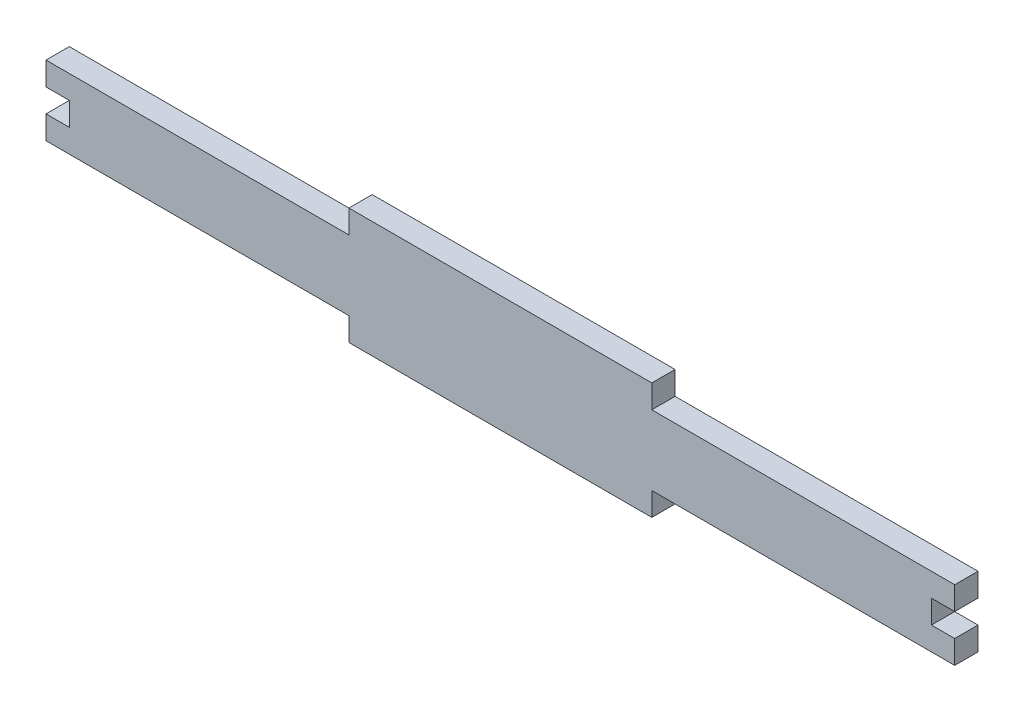
ISO-10303-21;
HEADER;
FILE_DESCRIPTION(('STEP AP214'),'2;1');
FILE_NAME('part.step','',(''),(''),'','','');
FILE_SCHEMA(('AUTOMOTIVE_DESIGN { 1 0 10303 214 1 1 1 1 }'));
ENDSEC;
DATA;
#1=APPLICATION_CONTEXT('core data for automotive mechanical design processes');
#2=APPLICATION_PROTOCOL_DEFINITION('international standard','automotive_design',2000,#1);
#3=PRODUCT_CONTEXT('',#1,'mechanical');
#4=PRODUCT('Part','Part','',(#3));
#5=PRODUCT_RELATED_PRODUCT_CATEGORY('part','',(#4));
#6=PRODUCT_DEFINITION_FORMATION('','',#4);
#7=PRODUCT_DEFINITION_CONTEXT('part definition',#1,'design');
#8=PRODUCT_DEFINITION('design','',#6,#7);
#9=PRODUCT_DEFINITION_SHAPE('','',#8);
#10=(LENGTH_UNIT() NAMED_UNIT(*) SI_UNIT(.MILLI.,.METRE.));
#11=(NAMED_UNIT(*) PLANE_ANGLE_UNIT() SI_UNIT($,.RADIAN.));
#12=(NAMED_UNIT(*) SI_UNIT($,.STERADIAN.) SOLID_ANGLE_UNIT());
#13=UNCERTAINTY_MEASURE_WITH_UNIT(LENGTH_MEASURE(1.E-05),#10,'distance_accuracy_value','');
#14=(GEOMETRIC_REPRESENTATION_CONTEXT(3) GLOBAL_UNCERTAINTY_ASSIGNED_CONTEXT((#13)) GLOBAL_UNIT_ASSIGNED_CONTEXT((#10,
#11,#12)) REPRESENTATION_CONTEXT('',''));
#15=CARTESIAN_POINT('',(0.,0.,0.));
#16=DIRECTION('',(0.,0.,1.));
#17=DIRECTION('',(1.,0.,0.));
#18=AXIS2_PLACEMENT_3D('',#15,#16,#17);
#19=CARTESIAN_POINT('',(-19.5,-7.5,3.));
#20=DIRECTION('',(1.,0.,0.));
#21=DIRECTION('',(0.,1.,0.));
#22=AXIS2_PLACEMENT_3D('',#19,#20,#21);
#23=PLANE('',#22);
#24=DIRECTION('',(0.,-1.,0.));
#25=VECTOR('',#24,1.);
#26=CARTESIAN_POINT('',(-19.5,-7.5,0.));
#27=LINE('',#26,#25);
#28=CARTESIAN_POINT('',(-19.5,-4.49999999999999,0.));
#29=VERTEX_POINT('',#28);
#30=CARTESIAN_POINT('',(-19.5,-7.5,0.));
#31=VERTEX_POINT('',#30);
#32=EDGE_CURVE('E201',#29,#31,#27,.T.);
#33=ORIENTED_EDGE('',*,*,#32,.T.);
#34=DIRECTION('',(0.,0.,-1.));
#35=VECTOR('',#34,1.);
#36=CARTESIAN_POINT('',(-19.5,-7.5,3.));
#37=LINE('',#36,#35);
#38=CARTESIAN_POINT('',(-19.5,-7.5,3.));
#39=VERTEX_POINT('',#38);
#40=EDGE_CURVE('E11',#39,#31,#37,.T.);
#41=ORIENTED_EDGE('',*,*,#40,.F.);
#42=DIRECTION('',(0.,-1.,0.));
#43=VECTOR('',#42,1.);
#44=CARTESIAN_POINT('',(-19.5,-7.5,3.));
#45=LINE('',#44,#43);
#46=CARTESIAN_POINT('',(-19.5,-4.49999999999999,3.));
#47=VERTEX_POINT('',#46);
#48=EDGE_CURVE('E239',#47,#39,#45,.T.);
#49=ORIENTED_EDGE('',*,*,#48,.F.);
#50=DIRECTION('',(0.,0.,-1.));
#51=VECTOR('',#50,1.);
#52=CARTESIAN_POINT('',(-19.5,-4.49999999999999,3.));
#53=LINE('',#52,#51);
#54=EDGE_CURVE('E197',#47,#29,#53,.T.);
#55=ORIENTED_EDGE('',*,*,#54,.T.);
#56=EDGE_LOOP('',(#33,#41,#49,#55));
#57=FACE_BOUND('',#56,.T.);
#58=ADVANCED_FACE('F33',(#57),#23,.F.);
#59=CARTESIAN_POINT('',(-19.5,-7.5,3.));
#60=DIRECTION('',(0.,1.,0.));
#61=DIRECTION('',(0.,0.,1.));
#62=AXIS2_PLACEMENT_3D('',#59,#60,#61);
#63=PLANE('',#62);
#64=DIRECTION('',(1.,0.,0.));
#65=VECTOR('',#64,1.);
#66=CARTESIAN_POINT('',(-19.5,-7.5,0.));
#67=LINE('',#66,#65);
#68=CARTESIAN_POINT('',(19.5,-7.5,0.));
#69=VERTEX_POINT('',#68);
#70=EDGE_CURVE('E204',#31,#69,#67,.T.);
#71=ORIENTED_EDGE('',*,*,#70,.T.);
#72=DIRECTION('',(0.,0.,-1.));
#73=VECTOR('',#72,1.);
#74=CARTESIAN_POINT('',(19.5,-7.5,3.));
#75=LINE('',#74,#73);
#76=CARTESIAN_POINT('',(19.5,-7.5,3.));
#77=VERTEX_POINT('',#76);
#78=EDGE_CURVE('E41',#77,#69,#75,.T.);
#79=ORIENTED_EDGE('',*,*,#78,.F.);
#80=DIRECTION('',(1.,0.,0.));
#81=VECTOR('',#80,1.);
#82=CARTESIAN_POINT('',(-19.5,-7.5,3.));
#83=LINE('',#82,#81);
#84=EDGE_CURVE('E128',#39,#77,#83,.T.);
#85=ORIENTED_EDGE('',*,*,#84,.F.);
#86=ORIENTED_EDGE('',*,*,#40,.T.);
#87=EDGE_LOOP('',(#71,#79,#85,#86));
#88=FACE_BOUND('',#87,.T.);
#89=ADVANCED_FACE('F357',(#88),#63,.F.);
#90=CARTESIAN_POINT('',(19.5,-4.49999999999999,3.));
#91=DIRECTION('',(-1.,0.,0.));
#92=DIRECTION('',(0.,-1.,0.));
#93=AXIS2_PLACEMENT_3D('',#90,#91,#92);
#94=PLANE('',#93);
#95=DIRECTION('',(0.,1.,0.));
#96=VECTOR('',#95,1.);
#97=CARTESIAN_POINT('',(19.5,-4.49999999999999,0.));
#98=LINE('',#97,#96);
#99=CARTESIAN_POINT('',(19.5,-4.49999999999999,0.));
#100=VERTEX_POINT('',#99);
#101=EDGE_CURVE('E206',#69,#100,#98,.T.);
#102=ORIENTED_EDGE('',*,*,#101,.T.);
#103=DIRECTION('',(0.,0.,-1.));
#104=VECTOR('',#103,1.);
#105=CARTESIAN_POINT('',(19.5,-4.49999999999999,3.));
#106=LINE('',#105,#104);
#107=CARTESIAN_POINT('',(19.5,-4.49999999999999,3.));
#108=VERTEX_POINT('',#107);
#109=EDGE_CURVE('E282',#108,#100,#106,.T.);
#110=ORIENTED_EDGE('',*,*,#109,.F.);
#111=DIRECTION('',(0.,1.,0.));
#112=VECTOR('',#111,1.);
#113=CARTESIAN_POINT('',(19.5,-4.49999999999999,3.));
#114=LINE('',#113,#112);
#115=EDGE_CURVE('E290',#77,#108,#114,.T.);
#116=ORIENTED_EDGE('',*,*,#115,.F.);
#117=ORIENTED_EDGE('',*,*,#78,.T.);
#118=EDGE_LOOP('',(#102,#110,#116,#117));
#119=FACE_BOUND('',#118,.T.);
#120=ADVANCED_FACE('F288',(#119),#94,.F.);
#121=CARTESIAN_POINT('',(58.5,-4.5,3.));
#122=DIRECTION('',(0.,1.,0.));
#123=DIRECTION('',(-1.,0.,0.));
#124=AXIS2_PLACEMENT_3D('',#121,#122,#123);
#125=PLANE('',#124);
#126=DIRECTION('',(1.,0.,0.));
#127=VECTOR('',#126,1.);
#128=CARTESIAN_POINT('',(58.5,-4.5,0.));
#129=LINE('',#128,#127);
#130=CARTESIAN_POINT('',(58.5,-4.5,0.));
#131=VERTEX_POINT('',#130);
#132=EDGE_CURVE('E208',#100,#131,#129,.T.);
#133=ORIENTED_EDGE('',*,*,#132,.T.);
#134=DIRECTION('',(0.,0.,-1.));
#135=VECTOR('',#134,1.);
#136=CARTESIAN_POINT('',(58.5,-4.5,3.));
#137=LINE('',#136,#135);
#138=CARTESIAN_POINT('',(58.5,-4.5,3.));
#139=VERTEX_POINT('',#138);
#140=EDGE_CURVE('E279',#139,#131,#137,.T.);
#141=ORIENTED_EDGE('',*,*,#140,.F.);
#142=DIRECTION('',(1.,0.,0.));
#143=VECTOR('',#142,1.);
#144=CARTESIAN_POINT('',(58.5,-4.5,3.));
#145=LINE('',#144,#143);
#146=EDGE_CURVE('E308',#108,#139,#145,.T.);
#147=ORIENTED_EDGE('',*,*,#146,.F.);
#148=ORIENTED_EDGE('',*,*,#109,.T.);
#149=EDGE_LOOP('',(#133,#141,#147,#148));
#150=FACE_BOUND('',#149,.T.);
#151=ADVANCED_FACE('F299',(#150),#125,.F.);
#152=CARTESIAN_POINT('',(58.5,-1.50000000000002,3.));
#153=DIRECTION('',(-1.,0.,0.));
#154=DIRECTION('',(0.,0.,1.));
#155=AXIS2_PLACEMENT_3D('',#152,#153,#154);
#156=PLANE('',#155);
#157=DIRECTION('',(0.,1.,0.));
#158=VECTOR('',#157,1.);
#159=CARTESIAN_POINT('',(58.5,-1.50000000000002,0.));
#160=LINE('',#159,#158);
#161=CARTESIAN_POINT('',(58.5,-1.50000000000002,0.));
#162=VERTEX_POINT('',#161);
#163=EDGE_CURVE('E210',#131,#162,#160,.T.);
#164=ORIENTED_EDGE('',*,*,#163,.T.);
#165=DIRECTION('',(0.,0.,-1.));
#166=VECTOR('',#165,1.);
#167=CARTESIAN_POINT('',(58.5,-1.50000000000002,3.));
#168=LINE('',#167,#166);
#169=CARTESIAN_POINT('',(58.5,-1.50000000000002,3.));
#170=VERTEX_POINT('',#169);
#171=EDGE_CURVE('E276',#170,#162,#168,.T.);
#172=ORIENTED_EDGE('',*,*,#171,.F.);
#173=DIRECTION('',(0.,1.,0.));
#174=VECTOR('',#173,1.);
#175=CARTESIAN_POINT('',(58.5,-1.50000000000002,3.));
#176=LINE('',#175,#174);
#177=EDGE_CURVE('E305',#139,#170,#176,.T.);
#178=ORIENTED_EDGE('',*,*,#177,.F.);
#179=ORIENTED_EDGE('',*,*,#140,.T.);
#180=EDGE_LOOP('',(#164,#172,#178,#179));
#181=FACE_BOUND('',#180,.T.);
#182=ADVANCED_FACE('F303',(#181),#156,.F.);
#183=CARTESIAN_POINT('',(58.5,-1.50000000000002,3.));
#184=DIRECTION('',(0.,-1.,0.));
#185=DIRECTION('',(0.,0.,-1.));
#186=AXIS2_PLACEMENT_3D('',#183,#184,#185);
#187=PLANE('',#186);
#188=DIRECTION('',(-1.,0.,0.));
#189=VECTOR('',#188,1.);
#190=CARTESIAN_POINT('',(58.5,-1.50000000000002,0.));
#191=LINE('',#190,#189);
#192=CARTESIAN_POINT('',(55.5,-1.50000000000002,0.));
#193=VERTEX_POINT('',#192);
#194=EDGE_CURVE('E212',#162,#193,#191,.T.);
#195=ORIENTED_EDGE('',*,*,#194,.T.);
#196=DIRECTION('',(0.,0.,-1.));
#197=VECTOR('',#196,1.);
#198=CARTESIAN_POINT('',(55.5,-1.50000000000002,3.));
#199=LINE('',#198,#197);
#200=CARTESIAN_POINT('',(55.5,-1.50000000000002,3.));
#201=VERTEX_POINT('',#200);
#202=EDGE_CURVE('E273',#201,#193,#199,.T.);
#203=ORIENTED_EDGE('',*,*,#202,.F.);
#204=DIRECTION('',(-1.,0.,0.));
#205=VECTOR('',#204,1.);
#206=CARTESIAN_POINT('',(58.5,-1.50000000000002,3.));
#207=LINE('',#206,#205);
#208=EDGE_CURVE('E307',#170,#201,#207,.T.);
#209=ORIENTED_EDGE('',*,*,#208,.F.);
#210=ORIENTED_EDGE('',*,*,#171,.T.);
#211=EDGE_LOOP('',(#195,#203,#209,#210));
#212=FACE_BOUND('',#211,.T.);
#213=ADVANCED_FACE('F370',(#212),#187,.F.);
#214=CARTESIAN_POINT('',(55.5,-1.50000000000002,3.));
#215=DIRECTION('',(-1.,0.,0.));
#216=DIRECTION('',(0.,-1.,0.));
#217=AXIS2_PLACEMENT_3D('',#214,#215,#216);
#218=PLANE('',#217);
#219=DIRECTION('',(0.,1.,0.));
#220=VECTOR('',#219,1.);
#221=CARTESIAN_POINT('',(55.5,-1.50000000000002,0.));
#222=LINE('',#221,#220);
#223=CARTESIAN_POINT('',(55.5,1.49999999999998,0.));
#224=VERTEX_POINT('',#223);
#225=EDGE_CURVE('E214',#193,#224,#222,.T.);
#226=ORIENTED_EDGE('',*,*,#225,.T.);
#227=DIRECTION('',(0.,0.,-1.));
#228=VECTOR('',#227,1.);
#229=CARTESIAN_POINT('',(55.5,1.49999999999998,3.));
#230=LINE('',#229,#228);
#231=CARTESIAN_POINT('',(55.5,1.49999999999998,3.));
#232=VERTEX_POINT('',#231);
#233=EDGE_CURVE('E270',#232,#224,#230,.T.);
#234=ORIENTED_EDGE('',*,*,#233,.F.);
#235=DIRECTION('',(0.,1.,0.));
#236=VECTOR('',#235,1.);
#237=CARTESIAN_POINT('',(55.5,-1.50000000000002,3.));
#238=LINE('',#237,#236);
#239=EDGE_CURVE('E310',#201,#232,#238,.T.);
#240=ORIENTED_EDGE('',*,*,#239,.F.);
#241=ORIENTED_EDGE('',*,*,#202,.T.);
#242=EDGE_LOOP('',(#226,#234,#240,#241));
#243=FACE_BOUND('',#242,.T.);
#244=ADVANCED_FACE('F373',(#243),#218,.F.);
#245=CARTESIAN_POINT('',(55.5,1.49999999999998,3.));
#246=DIRECTION('',(0.,1.,0.));
#247=DIRECTION('',(-1.,0.,0.));
#248=AXIS2_PLACEMENT_3D('',#245,#246,#247);
#249=PLANE('',#248);
#250=DIRECTION('',(1.,0.,0.));
#251=VECTOR('',#250,1.);
#252=CARTESIAN_POINT('',(55.5,1.49999999999998,0.));
#253=LINE('',#252,#251);
#254=CARTESIAN_POINT('',(58.5,1.49999999999998,0.));
#255=VERTEX_POINT('',#254);
#256=EDGE_CURVE('E216',#224,#255,#253,.T.);
#257=ORIENTED_EDGE('',*,*,#256,.T.);
#258=DIRECTION('',(0.,0.,-1.));
#259=VECTOR('',#258,1.);
#260=CARTESIAN_POINT('',(58.5,1.49999999999998,3.));
#261=LINE('',#260,#259);
#262=CARTESIAN_POINT('',(58.5,1.49999999999998,3.));
#263=VERTEX_POINT('',#262);
#264=EDGE_CURVE('E267',#263,#255,#261,.T.);
#265=ORIENTED_EDGE('',*,*,#264,.F.);
#266=DIRECTION('',(1.,0.,0.));
#267=VECTOR('',#266,1.);
#268=CARTESIAN_POINT('',(55.5,1.49999999999998,3.));
#269=LINE('',#268,#267);
#270=EDGE_CURVE('E316',#232,#263,#269,.T.);
#271=ORIENTED_EDGE('',*,*,#270,.F.);
#272=ORIENTED_EDGE('',*,*,#233,.T.);
#273=EDGE_LOOP('',(#257,#265,#271,#272));
#274=FACE_BOUND('',#273,.T.);
#275=ADVANCED_FACE('F377',(#274),#249,.F.);
#276=CARTESIAN_POINT('',(58.5,4.49999999999998,3.));
#277=DIRECTION('',(-1.,0.,0.));
#278=DIRECTION('',(0.,0.,1.));
#279=AXIS2_PLACEMENT_3D('',#276,#277,#278);
#280=PLANE('',#279);
#281=DIRECTION('',(0.,1.,0.));
#282=VECTOR('',#281,1.);
#283=CARTESIAN_POINT('',(58.5,4.49999999999998,0.));
#284=LINE('',#283,#282);
#285=CARTESIAN_POINT('',(58.5,4.49999999999998,0.));
#286=VERTEX_POINT('',#285);
#287=EDGE_CURVE('E218',#255,#286,#284,.T.);
#288=ORIENTED_EDGE('',*,*,#287,.T.);
#289=DIRECTION('',(0.,0.,-1.));
#290=VECTOR('',#289,1.);
#291=CARTESIAN_POINT('',(58.5,4.49999999999998,3.));
#292=LINE('',#291,#290);
#293=CARTESIAN_POINT('',(58.5,4.49999999999998,3.));
#294=VERTEX_POINT('',#293);
#295=EDGE_CURVE('E264',#294,#286,#292,.T.);
#296=ORIENTED_EDGE('',*,*,#295,.F.);
#297=DIRECTION('',(0.,1.,0.));
#298=VECTOR('',#297,1.);
#299=CARTESIAN_POINT('',(58.5,4.49999999999998,3.));
#300=LINE('',#299,#298);
#301=EDGE_CURVE('E318',#263,#294,#300,.T.);
#302=ORIENTED_EDGE('',*,*,#301,.F.);
#303=ORIENTED_EDGE('',*,*,#264,.T.);
#304=EDGE_LOOP('',(#288,#296,#302,#303));
#305=FACE_BOUND('',#304,.T.);
#306=ADVANCED_FACE('F381',(#305),#280,.F.);
#307=CARTESIAN_POINT('',(19.5,4.49999999999998,3.));
#308=DIRECTION('',(0.,-1.,0.));
#309=DIRECTION('',(1.,0.,0.));
#310=AXIS2_PLACEMENT_3D('',#307,#308,#309);
#311=PLANE('',#310);
#312=DIRECTION('',(-1.,0.,0.));
#313=VECTOR('',#312,1.);
#314=CARTESIAN_POINT('',(19.5,4.49999999999998,0.));
#315=LINE('',#314,#313);
#316=CARTESIAN_POINT('',(19.5,4.49999999999998,0.));
#317=VERTEX_POINT('',#316);
#318=EDGE_CURVE('E220',#286,#317,#315,.T.);
#319=ORIENTED_EDGE('',*,*,#318,.T.);
#320=DIRECTION('',(0.,0.,-1.));
#321=VECTOR('',#320,1.);
#322=CARTESIAN_POINT('',(19.5,4.49999999999998,3.));
#323=LINE('',#322,#321);
#324=CARTESIAN_POINT('',(19.5,4.49999999999998,3.));
#325=VERTEX_POINT('',#324);
#326=EDGE_CURVE('E261',#325,#317,#323,.T.);
#327=ORIENTED_EDGE('',*,*,#326,.F.);
#328=DIRECTION('',(-1.,0.,0.));
#329=VECTOR('',#328,1.);
#330=CARTESIAN_POINT('',(19.5,4.49999999999998,3.));
#331=LINE('',#330,#329);
#332=EDGE_CURVE('E320',#294,#325,#331,.T.);
#333=ORIENTED_EDGE('',*,*,#332,.F.);
#334=ORIENTED_EDGE('',*,*,#295,.T.);
#335=EDGE_LOOP('',(#319,#327,#333,#334));
#336=FACE_BOUND('',#335,.T.);
#337=ADVANCED_FACE('F385',(#336),#311,.F.);
#338=CARTESIAN_POINT('',(19.5,7.5,3.));
#339=DIRECTION('',(-1.,0.,0.));
#340=DIRECTION('',(0.,-1.,0.));
#341=AXIS2_PLACEMENT_3D('',#338,#339,#340);
#342=PLANE('',#341);
#343=DIRECTION('',(0.,1.,0.));
#344=VECTOR('',#343,1.);
#345=CARTESIAN_POINT('',(19.5,7.5,0.));
#346=LINE('',#345,#344);
#347=CARTESIAN_POINT('',(19.5,7.5,0.));
#348=VERTEX_POINT('',#347);
#349=EDGE_CURVE('E222',#317,#348,#346,.T.);
#350=ORIENTED_EDGE('',*,*,#349,.T.);
#351=DIRECTION('',(0.,0.,-1.));
#352=VECTOR('',#351,1.);
#353=CARTESIAN_POINT('',(19.5,7.5,3.));
#354=LINE('',#353,#352);
#355=CARTESIAN_POINT('',(19.5,7.5,3.));
#356=VERTEX_POINT('',#355);
#357=EDGE_CURVE('E258',#356,#348,#354,.T.);
#358=ORIENTED_EDGE('',*,*,#357,.F.);
#359=DIRECTION('',(0.,1.,0.));
#360=VECTOR('',#359,1.);
#361=CARTESIAN_POINT('',(19.5,7.5,3.));
#362=LINE('',#361,#360);
#363=EDGE_CURVE('E322',#325,#356,#362,.T.);
#364=ORIENTED_EDGE('',*,*,#363,.F.);
#365=ORIENTED_EDGE('',*,*,#326,.T.);
#366=EDGE_LOOP('',(#350,#358,#364,#365));
#367=FACE_BOUND('',#366,.T.);
#368=ADVANCED_FACE('F389',(#367),#342,.F.);
#369=CARTESIAN_POINT('',(19.5,7.5,3.));
#370=DIRECTION('',(0.,-1.,0.));
#371=DIRECTION('',(1.,0.,0.));
#372=AXIS2_PLACEMENT_3D('',#369,#370,#371);
#373=PLANE('',#372);
#374=DIRECTION('',(-1.,0.,0.));
#375=VECTOR('',#374,1.);
#376=CARTESIAN_POINT('',(19.5,7.5,0.));
#377=LINE('',#376,#375);
#378=CARTESIAN_POINT('',(-19.5,7.5,0.));
#379=VERTEX_POINT('',#378);
#380=EDGE_CURVE('E224',#348,#379,#377,.T.);
#381=ORIENTED_EDGE('',*,*,#380,.T.);
#382=DIRECTION('',(0.,0.,-1.));
#383=VECTOR('',#382,1.);
#384=CARTESIAN_POINT('',(-19.5,7.5,3.));
#385=LINE('',#384,#383);
#386=CARTESIAN_POINT('',(-19.5,7.5,3.));
#387=VERTEX_POINT('',#386);
#388=EDGE_CURVE('E255',#387,#379,#385,.T.);
#389=ORIENTED_EDGE('',*,*,#388,.F.);
#390=DIRECTION('',(-1.,0.,0.));
#391=VECTOR('',#390,1.);
#392=CARTESIAN_POINT('',(19.5,7.5,3.));
#393=LINE('',#392,#391);
#394=EDGE_CURVE('E324',#356,#387,#393,.T.);
#395=ORIENTED_EDGE('',*,*,#394,.F.);
#396=ORIENTED_EDGE('',*,*,#357,.T.);
#397=EDGE_LOOP('',(#381,#389,#395,#396));
#398=FACE_BOUND('',#397,.T.);
#399=ADVANCED_FACE('F393',(#398),#373,.F.);
#400=CARTESIAN_POINT('',(-19.5,7.5,3.));
#401=DIRECTION('',(1.,0.,0.));
#402=DIRECTION('',(0.,1.,0.));
#403=AXIS2_PLACEMENT_3D('',#400,#401,#402);
#404=PLANE('',#403);
#405=DIRECTION('',(0.,-1.,0.));
#406=VECTOR('',#405,1.);
#407=CARTESIAN_POINT('',(-19.5,7.5,0.));
#408=LINE('',#407,#406);
#409=CARTESIAN_POINT('',(-19.5,4.49999999999998,0.));
#410=VERTEX_POINT('',#409);
#411=EDGE_CURVE('E226',#379,#410,#408,.T.);
#412=ORIENTED_EDGE('',*,*,#411,.T.);
#413=DIRECTION('',(0.,0.,-1.));
#414=VECTOR('',#413,1.);
#415=CARTESIAN_POINT('',(-19.5,4.49999999999998,3.));
#416=LINE('',#415,#414);
#417=CARTESIAN_POINT('',(-19.5,4.49999999999998,3.));
#418=VERTEX_POINT('',#417);
#419=EDGE_CURVE('E252',#418,#410,#416,.T.);
#420=ORIENTED_EDGE('',*,*,#419,.F.);
#421=DIRECTION('',(0.,-1.,0.));
#422=VECTOR('',#421,1.);
#423=CARTESIAN_POINT('',(-19.5,7.5,3.));
#424=LINE('',#423,#422);
#425=EDGE_CURVE('E326',#387,#418,#424,.T.);
#426=ORIENTED_EDGE('',*,*,#425,.F.);
#427=ORIENTED_EDGE('',*,*,#388,.T.);
#428=EDGE_LOOP('',(#412,#420,#426,#427));
#429=FACE_BOUND('',#428,.T.);
#430=ADVANCED_FACE('F397',(#429),#404,.F.);
#431=CARTESIAN_POINT('',(-19.5,4.49999999999998,3.));
#432=DIRECTION('',(0.,-1.,0.));
#433=DIRECTION('',(1.,0.,0.));
#434=AXIS2_PLACEMENT_3D('',#431,#432,#433);
#435=PLANE('',#434);
#436=DIRECTION('',(-1.,0.,0.));
#437=VECTOR('',#436,1.);
#438=CARTESIAN_POINT('',(-19.5,4.49999999999998,0.));
#439=LINE('',#438,#437);
#440=CARTESIAN_POINT('',(-58.5,4.49999999999998,0.));
#441=VERTEX_POINT('',#440);
#442=EDGE_CURVE('E228',#410,#441,#439,.T.);
#443=ORIENTED_EDGE('',*,*,#442,.T.);
#444=DIRECTION('',(0.,0.,-1.));
#445=VECTOR('',#444,1.);
#446=CARTESIAN_POINT('',(-58.5,4.49999999999998,3.));
#447=LINE('',#446,#445);
#448=CARTESIAN_POINT('',(-58.5,4.49999999999998,3.));
#449=VERTEX_POINT('',#448);
#450=EDGE_CURVE('E249',#449,#441,#447,.T.);
#451=ORIENTED_EDGE('',*,*,#450,.F.);
#452=DIRECTION('',(-1.,0.,0.));
#453=VECTOR('',#452,1.);
#454=CARTESIAN_POINT('',(-19.5,4.49999999999998,3.));
#455=LINE('',#454,#453);
#456=EDGE_CURVE('E328',#418,#449,#455,.T.);
#457=ORIENTED_EDGE('',*,*,#456,.F.);
#458=ORIENTED_EDGE('',*,*,#419,.T.);
#459=EDGE_LOOP('',(#443,#451,#457,#458));
#460=FACE_BOUND('',#459,.T.);
#461=ADVANCED_FACE('F401',(#460),#435,.F.);
#462=CARTESIAN_POINT('',(-58.5,4.49999999999998,3.));
#463=DIRECTION('',(1.,0.,0.));
#464=DIRECTION('',(0.,0.,-1.));
#465=AXIS2_PLACEMENT_3D('',#462,#463,#464);
#466=PLANE('',#465);
#467=DIRECTION('',(0.,-1.,0.));
#468=VECTOR('',#467,1.);
#469=CARTESIAN_POINT('',(-58.5,4.49999999999998,0.));
#470=LINE('',#469,#468);
#471=CARTESIAN_POINT('',(-58.5,1.49999999999999,0.));
#472=VERTEX_POINT('',#471);
#473=EDGE_CURVE('E230',#441,#472,#470,.T.);
#474=ORIENTED_EDGE('',*,*,#473,.T.);
#475=DIRECTION('',(0.,0.,-1.));
#476=VECTOR('',#475,1.);
#477=CARTESIAN_POINT('',(-58.5,1.49999999999999,3.));
#478=LINE('',#477,#476);
#479=CARTESIAN_POINT('',(-58.5,1.49999999999999,3.));
#480=VERTEX_POINT('',#479);
#481=EDGE_CURVE('E246',#480,#472,#478,.T.);
#482=ORIENTED_EDGE('',*,*,#481,.F.);
#483=DIRECTION('',(0.,-1.,0.));
#484=VECTOR('',#483,1.);
#485=CARTESIAN_POINT('',(-58.5,4.49999999999998,3.));
#486=LINE('',#485,#484);
#487=EDGE_CURVE('E330',#449,#480,#486,.T.);
#488=ORIENTED_EDGE('',*,*,#487,.F.);
#489=ORIENTED_EDGE('',*,*,#450,.T.);
#490=EDGE_LOOP('',(#474,#482,#488,#489));
#491=FACE_BOUND('',#490,.T.);
#492=ADVANCED_FACE('F405',(#491),#466,.F.);
#493=CARTESIAN_POINT('',(-58.5,1.49999999999999,3.));
#494=DIRECTION('',(0.,1.,0.));
#495=DIRECTION('',(0.,0.,1.));
#496=AXIS2_PLACEMENT_3D('',#493,#494,#495);
#497=PLANE('',#496);
#498=DIRECTION('',(1.,0.,0.));
#499=VECTOR('',#498,1.);
#500=CARTESIAN_POINT('',(-58.5,1.49999999999999,0.));
#501=LINE('',#500,#499);
#502=CARTESIAN_POINT('',(-55.5,1.49999999999999,0.));
#503=VERTEX_POINT('',#502);
#504=EDGE_CURVE('E232',#472,#503,#501,.T.);
#505=ORIENTED_EDGE('',*,*,#504,.T.);
#506=DIRECTION('',(0.,0.,-1.));
#507=VECTOR('',#506,1.);
#508=CARTESIAN_POINT('',(-55.5,1.49999999999999,3.));
#509=LINE('',#508,#507);
#510=CARTESIAN_POINT('',(-55.5,1.49999999999999,3.));
#511=VERTEX_POINT('',#510);
#512=EDGE_CURVE('E243',#511,#503,#509,.T.);
#513=ORIENTED_EDGE('',*,*,#512,.F.);
#514=DIRECTION('',(1.,0.,0.));
#515=VECTOR('',#514,1.);
#516=CARTESIAN_POINT('',(-58.5,1.49999999999999,3.));
#517=LINE('',#516,#515);
#518=EDGE_CURVE('E332',#480,#511,#517,.T.);
#519=ORIENTED_EDGE('',*,*,#518,.F.);
#520=ORIENTED_EDGE('',*,*,#481,.T.);
#521=EDGE_LOOP('',(#505,#513,#519,#520));
#522=FACE_BOUND('',#521,.T.);
#523=ADVANCED_FACE('F338',(#522),#497,.F.);
#524=CARTESIAN_POINT('',(-55.5,1.49999999999999,3.));
#525=DIRECTION('',(1.,0.,0.));
#526=DIRECTION('',(0.,0.,-1.));
#527=AXIS2_PLACEMENT_3D('',#524,#525,#526);
#528=PLANE('',#527);
#529=DIRECTION('',(0.,-1.,0.));
#530=VECTOR('',#529,1.);
#531=CARTESIAN_POINT('',(-55.5,1.49999999999999,0.));
#532=LINE('',#531,#530);
#533=CARTESIAN_POINT('',(-55.5,-1.5,0.));
#534=VERTEX_POINT('',#533);
#535=EDGE_CURVE('E234',#503,#534,#532,.T.);
#536=ORIENTED_EDGE('',*,*,#535,.T.);
#537=DIRECTION('',(0.,0.,-1.));
#538=VECTOR('',#537,1.);
#539=CARTESIAN_POINT('',(-55.5,-1.5,3.));
#540=LINE('',#539,#538);
#541=CARTESIAN_POINT('',(-55.5,-1.5,3.));
#542=VERTEX_POINT('',#541);
#543=EDGE_CURVE('E192',#542,#534,#540,.T.);
#544=ORIENTED_EDGE('',*,*,#543,.F.);
#545=DIRECTION('',(0.,-1.,0.));
#546=VECTOR('',#545,1.);
#547=CARTESIAN_POINT('',(-55.5,1.49999999999999,3.));
#548=LINE('',#547,#546);
#549=EDGE_CURVE('E183',#511,#542,#548,.T.);
#550=ORIENTED_EDGE('',*,*,#549,.F.);
#551=ORIENTED_EDGE('',*,*,#512,.T.);
#552=EDGE_LOOP('',(#536,#544,#550,#551));
#553=FACE_BOUND('',#552,.T.);
#554=ADVANCED_FACE('F342',(#553),#528,.F.);
#555=CARTESIAN_POINT('',(-55.5,-1.5,3.));
#556=DIRECTION('',(0.,-1.,0.));
#557=DIRECTION('',(1.,0.,0.));
#558=AXIS2_PLACEMENT_3D('',#555,#556,#557);
#559=PLANE('',#558);
#560=DIRECTION('',(-1.,0.,0.));
#561=VECTOR('',#560,1.);
#562=CARTESIAN_POINT('',(-55.5,-1.5,0.));
#563=LINE('',#562,#561);
#564=CARTESIAN_POINT('',(-58.5,-1.5,0.));
#565=VERTEX_POINT('',#564);
#566=EDGE_CURVE('E191',#534,#565,#563,.T.);
#567=ORIENTED_EDGE('',*,*,#566,.T.);
#568=DIRECTION('',(0.,0.,-1.));
#569=VECTOR('',#568,1.);
#570=CARTESIAN_POINT('',(-58.5,-1.5,3.));
#571=LINE('',#570,#569);
#572=CARTESIAN_POINT('',(-58.5,-1.5,3.));
#573=VERTEX_POINT('',#572);
#574=EDGE_CURVE('E188',#573,#565,#571,.T.);
#575=ORIENTED_EDGE('',*,*,#574,.F.);
#576=DIRECTION('',(-1.,0.,0.));
#577=VECTOR('',#576,1.);
#578=CARTESIAN_POINT('',(-55.5,-1.5,3.));
#579=LINE('',#578,#577);
#580=EDGE_CURVE('E177',#542,#573,#579,.T.);
#581=ORIENTED_EDGE('',*,*,#580,.F.);
#582=ORIENTED_EDGE('',*,*,#543,.T.);
#583=EDGE_LOOP('',(#567,#575,#581,#582));
#584=FACE_BOUND('',#583,.T.);
#585=ADVANCED_FACE('F189',(#584),#559,.F.);
#586=CARTESIAN_POINT('',(-58.5,-1.5,3.));
#587=DIRECTION('',(1.,0.,0.));
#588=DIRECTION('',(0.,0.,-1.));
#589=AXIS2_PLACEMENT_3D('',#586,#587,#588);
#590=PLANE('',#589);
#591=DIRECTION('',(0.,-1.,0.));
#592=VECTOR('',#591,1.);
#593=CARTESIAN_POINT('',(-58.5,-1.5,0.));
#594=LINE('',#593,#592);
#595=CARTESIAN_POINT('',(-58.5,-4.49999999999999,0.));
#596=VERTEX_POINT('',#595);
#597=EDGE_CURVE('E114',#565,#596,#594,.T.);
#598=ORIENTED_EDGE('',*,*,#597,.T.);
#599=DIRECTION('',(0.,0.,-1.));
#600=VECTOR('',#599,1.);
#601=CARTESIAN_POINT('',(-58.5,-4.49999999999999,3.));
#602=LINE('',#601,#600);
#603=CARTESIAN_POINT('',(-58.5,-4.49999999999999,3.));
#604=VERTEX_POINT('',#603);
#605=EDGE_CURVE('E193',#604,#596,#602,.T.);
#606=ORIENTED_EDGE('',*,*,#605,.F.);
#607=DIRECTION('',(0.,-1.,0.));
#608=VECTOR('',#607,1.);
#609=CARTESIAN_POINT('',(-58.5,-1.5,3.));
#610=LINE('',#609,#608);
#611=EDGE_CURVE('E181',#573,#604,#610,.T.);
#612=ORIENTED_EDGE('',*,*,#611,.F.);
#613=ORIENTED_EDGE('',*,*,#574,.T.);
#614=EDGE_LOOP('',(#598,#606,#612,#613));
#615=FACE_BOUND('',#614,.T.);
#616=ADVANCED_FACE('F195',(#615),#590,.F.);
#617=CARTESIAN_POINT('',(-19.5,-4.49999999999999,3.));
#618=DIRECTION('',(0.,1.,0.));
#619=DIRECTION('',(-1.,0.,0.));
#620=AXIS2_PLACEMENT_3D('',#617,#618,#619);
#621=PLANE('',#620);
#622=DIRECTION('',(1.,0.,0.));
#623=VECTOR('',#622,1.);
#624=CARTESIAN_POINT('',(-19.5,-4.49999999999999,0.));
#625=LINE('',#624,#623);
#626=EDGE_CURVE('E120',#596,#29,#625,.T.);
#627=ORIENTED_EDGE('',*,*,#626,.T.);
#628=ORIENTED_EDGE('',*,*,#54,.F.);
#629=DIRECTION('',(1.,0.,0.));
#630=VECTOR('',#629,1.);
#631=CARTESIAN_POINT('',(-19.5,-4.49999999999999,3.));
#632=LINE('',#631,#630);
#633=EDGE_CURVE('E49',#604,#47,#632,.T.);
#634=ORIENTED_EDGE('',*,*,#633,.F.);
#635=ORIENTED_EDGE('',*,*,#605,.T.);
#636=EDGE_LOOP('',(#627,#628,#634,#635));
#637=FACE_BOUND('',#636,.T.);
#638=ADVANCED_FACE('F346',(#637),#621,.F.);
#639=CARTESIAN_POINT('',(0.,0.,3.));
#640=DIRECTION('',(0.,0.,1.));
#641=DIRECTION('',(1.,0.,0.));
#642=AXIS2_PLACEMENT_3D('',#639,#640,#641);
#643=PLANE('',#642);
#644=ORIENTED_EDGE('',*,*,#48,.T.);
#645=ORIENTED_EDGE('',*,*,#84,.T.);
#646=ORIENTED_EDGE('',*,*,#115,.T.);
#647=ORIENTED_EDGE('',*,*,#146,.T.);
#648=ORIENTED_EDGE('',*,*,#177,.T.);
#649=ORIENTED_EDGE('',*,*,#208,.T.);
#650=ORIENTED_EDGE('',*,*,#239,.T.);
#651=ORIENTED_EDGE('',*,*,#270,.T.);
#652=ORIENTED_EDGE('',*,*,#301,.T.);
#653=ORIENTED_EDGE('',*,*,#332,.T.);
#654=ORIENTED_EDGE('',*,*,#363,.T.);
#655=ORIENTED_EDGE('',*,*,#394,.T.);
#656=ORIENTED_EDGE('',*,*,#425,.T.);
#657=ORIENTED_EDGE('',*,*,#456,.T.);
#658=ORIENTED_EDGE('',*,*,#487,.T.);
#659=ORIENTED_EDGE('',*,*,#518,.T.);
#660=ORIENTED_EDGE('',*,*,#549,.T.);
#661=ORIENTED_EDGE('',*,*,#580,.T.);
#662=ORIENTED_EDGE('',*,*,#611,.T.);
#663=ORIENTED_EDGE('',*,*,#633,.T.);
#664=EDGE_LOOP('',(#644,#645,#646,#647,#648,#649,#650,#651,#652,#653,#654,#655,#656,#657,#658,
#659,#660,#661,#662,#663));
#665=FACE_BOUND('',#664,.T.);
#666=ADVANCED_FACE('F179',(#665),#643,.T.);
#667=CARTESIAN_POINT('',(0.,0.,0.));
#668=DIRECTION('',(0.,0.,1.));
#669=DIRECTION('',(1.,0.,0.));
#670=AXIS2_PLACEMENT_3D('',#667,#668,#669);
#671=PLANE('',#670);
#672=ORIENTED_EDGE('',*,*,#32,.F.);
#673=ORIENTED_EDGE('',*,*,#626,.F.);
#674=ORIENTED_EDGE('',*,*,#597,.F.);
#675=ORIENTED_EDGE('',*,*,#566,.F.);
#676=ORIENTED_EDGE('',*,*,#535,.F.);
#677=ORIENTED_EDGE('',*,*,#504,.F.);
#678=ORIENTED_EDGE('',*,*,#473,.F.);
#679=ORIENTED_EDGE('',*,*,#442,.F.);
#680=ORIENTED_EDGE('',*,*,#411,.F.);
#681=ORIENTED_EDGE('',*,*,#380,.F.);
#682=ORIENTED_EDGE('',*,*,#349,.F.);
#683=ORIENTED_EDGE('',*,*,#318,.F.);
#684=ORIENTED_EDGE('',*,*,#287,.F.);
#685=ORIENTED_EDGE('',*,*,#256,.F.);
#686=ORIENTED_EDGE('',*,*,#225,.F.);
#687=ORIENTED_EDGE('',*,*,#194,.F.);
#688=ORIENTED_EDGE('',*,*,#163,.F.);
#689=ORIENTED_EDGE('',*,*,#132,.F.);
#690=ORIENTED_EDGE('',*,*,#101,.F.);
#691=ORIENTED_EDGE('',*,*,#70,.F.);
#692=EDGE_LOOP('',(#672,#673,#674,#675,#676,#677,#678,#679,#680,#681,#682,#683,#684,#685,#686,
#687,#688,#689,#690,#691));
#693=FACE_BOUND('',#692,.T.);
#694=ADVANCED_FACE('F294',(#693),#671,.F.);
#695=CLOSED_SHELL('',(#58,#89,#120,#151,#182,#213,#244,#275,#306,#337,#368,#399,#430,#461,#492,
#523,#554,#585,#616,#638,#666,#694));
#696=MANIFOLD_SOLID_BREP('B2',#695);
#697=ADVANCED_BREP_SHAPE_REPRESENTATION('',(#18,#696),#14);
#698=SHAPE_DEFINITION_REPRESENTATION(#9,#697);
ENDSEC;
END-ISO-10303-21;
